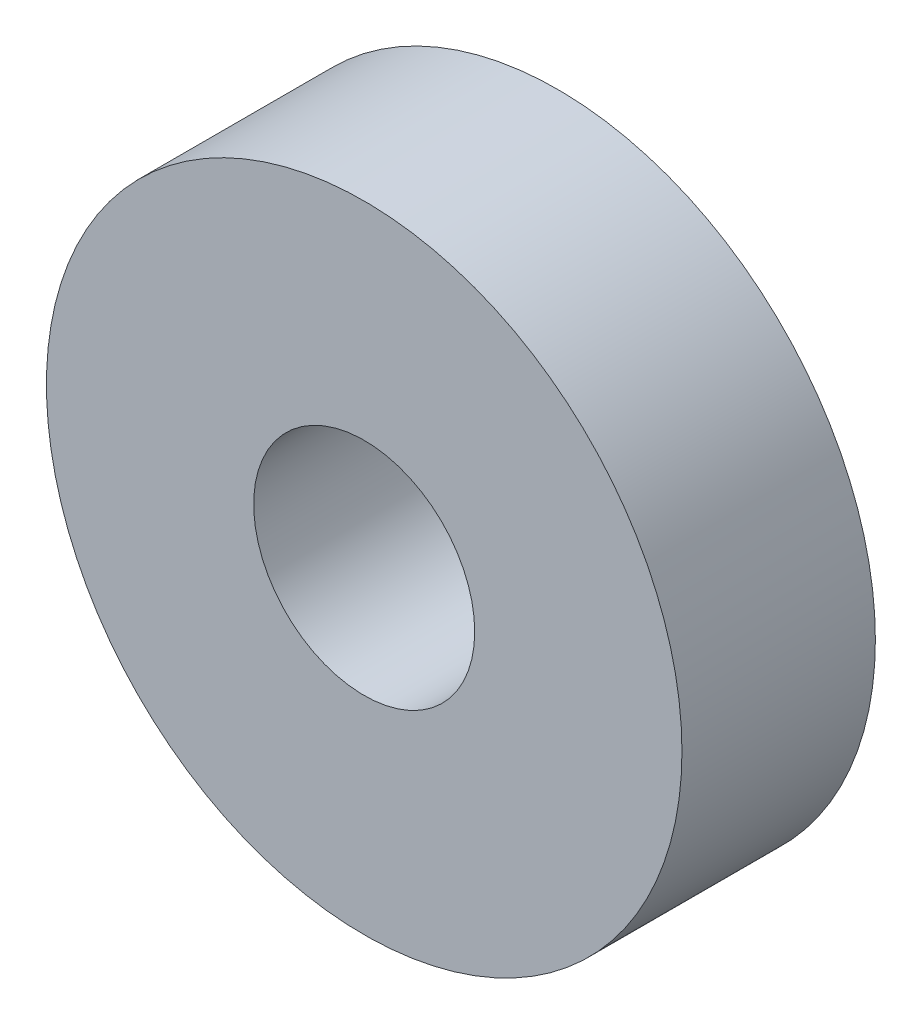
ISO-10303-21;
HEADER;
FILE_DESCRIPTION(('STEP AP214'),'2;1');
FILE_NAME('part.step','',(''),(''),'','','');
FILE_SCHEMA(('AUTOMOTIVE_DESIGN { 1 0 10303 214 1 1 1 1 }'));
ENDSEC;
DATA;
#1=APPLICATION_CONTEXT('core data for automotive mechanical design processes');
#2=APPLICATION_PROTOCOL_DEFINITION('international standard','automotive_design',2000,#1);
#3=PRODUCT_CONTEXT('',#1,'mechanical');
#4=PRODUCT('Part','Part','',(#3));
#5=PRODUCT_RELATED_PRODUCT_CATEGORY('part','',(#4));
#6=PRODUCT_DEFINITION_FORMATION('','',#4);
#7=PRODUCT_DEFINITION_CONTEXT('part definition',#1,'design');
#8=PRODUCT_DEFINITION('design','',#6,#7);
#9=PRODUCT_DEFINITION_SHAPE('','',#8);
#10=(LENGTH_UNIT() NAMED_UNIT(*) SI_UNIT(.MILLI.,.METRE.));
#11=(NAMED_UNIT(*) PLANE_ANGLE_UNIT() SI_UNIT($,.RADIAN.));
#12=(NAMED_UNIT(*) SI_UNIT($,.STERADIAN.) SOLID_ANGLE_UNIT());
#13=UNCERTAINTY_MEASURE_WITH_UNIT(LENGTH_MEASURE(1.E-05),#10,'distance_accuracy_value','');
#14=(GEOMETRIC_REPRESENTATION_CONTEXT(3) GLOBAL_UNCERTAINTY_ASSIGNED_CONTEXT((#13)) GLOBAL_UNIT_ASSIGNED_CONTEXT((#10,
#11,#12)) REPRESENTATION_CONTEXT('',''));
#15=CARTESIAN_POINT('',(0.,0.,0.));
#16=DIRECTION('',(0.,0.,1.));
#17=DIRECTION('',(1.,0.,0.));
#18=AXIS2_PLACEMENT_3D('',#15,#16,#17);
#19=CARTESIAN_POINT('',(0.,0.,7.));
#20=DIRECTION('',(0.,0.,1.));
#21=DIRECTION('',(1.,0.,0.));
#22=AXIS2_PLACEMENT_3D('',#19,#20,#21);
#23=PLANE('',#22);
#24=CARTESIAN_POINT('',(0.,0.,7.));
#25=DIRECTION('',(0.,0.,1.));
#26=DIRECTION('',(1.,0.,0.));
#27=AXIS2_PLACEMENT_3D('',#24,#25,#26);
#28=CIRCLE('',#27,11.5);
#29=CARTESIAN_POINT('',(11.5,0.,7.));
#30=VERTEX_POINT('',#29);
#31=EDGE_CURVE('E10',#30,#30,#28,.T.);
#32=ORIENTED_EDGE('',*,*,#31,.T.);
#33=EDGE_LOOP('',(#32));
#34=FACE_BOUND('',#33,.T.);
#35=CARTESIAN_POINT('',(0.,0.,7.));
#36=DIRECTION('',(0.,0.,1.));
#37=DIRECTION('',(1.,0.,0.));
#38=AXIS2_PLACEMENT_3D('',#35,#36,#37);
#39=CIRCLE('',#38,4.);
#40=CARTESIAN_POINT('',(4.,0.,7.));
#41=VERTEX_POINT('',#40);
#42=EDGE_CURVE('E45',#41,#41,#39,.T.);
#43=ORIENTED_EDGE('',*,*,#42,.F.);
#44=EDGE_LOOP('',(#43));
#45=FACE_BOUND('',#44,.T.);
#46=ADVANCED_FACE('F34',(#34,#45),#23,.T.);
#47=CARTESIAN_POINT('',(0.,0.,0.));
#48=DIRECTION('',(0.,0.,1.));
#49=DIRECTION('',(1.,0.,0.));
#50=AXIS2_PLACEMENT_3D('',#47,#48,#49);
#51=PLANE('',#50);
#52=CARTESIAN_POINT('',(0.,0.,0.));
#53=DIRECTION('',(0.,0.,1.));
#54=DIRECTION('',(1.,0.,0.));
#55=AXIS2_PLACEMENT_3D('',#52,#53,#54);
#56=CIRCLE('',#55,11.5);
#57=CARTESIAN_POINT('',(11.5,0.,0.));
#58=VERTEX_POINT('',#57);
#59=EDGE_CURVE('E38',#58,#58,#56,.T.);
#60=ORIENTED_EDGE('',*,*,#59,.F.);
#61=EDGE_LOOP('',(#60));
#62=FACE_BOUND('',#61,.T.);
#63=CARTESIAN_POINT('',(0.,0.,0.));
#64=DIRECTION('',(0.,0.,1.));
#65=DIRECTION('',(1.,0.,0.));
#66=AXIS2_PLACEMENT_3D('',#63,#64,#65);
#67=CIRCLE('',#66,4.);
#68=CARTESIAN_POINT('',(4.,0.,0.));
#69=VERTEX_POINT('',#68);
#70=EDGE_CURVE('E47',#69,#69,#67,.T.);
#71=ORIENTED_EDGE('',*,*,#70,.T.);
#72=EDGE_LOOP('',(#71));
#73=FACE_BOUND('',#72,.T.);
#74=ADVANCED_FACE('F57',(#62,#73),#51,.F.);
#75=CARTESIAN_POINT('',(0.,0.,7.));
#76=DIRECTION('',(0.,0.,-1.));
#77=DIRECTION('',(-1.,0.,0.));
#78=AXIS2_PLACEMENT_3D('',#75,#76,#77);
#79=CYLINDRICAL_SURFACE('',#78,11.5);
#80=ORIENTED_EDGE('',*,*,#31,.F.);
#81=EDGE_LOOP('',(#80));
#82=FACE_BOUND('',#81,.T.);
#83=ORIENTED_EDGE('',*,*,#59,.T.);
#84=EDGE_LOOP('',(#83));
#85=FACE_BOUND('',#84,.T.);
#86=ADVANCED_FACE('F36',(#82,#85),#79,.T.);
#87=CARTESIAN_POINT('',(0.,0.,7.));
#88=DIRECTION('',(0.,0.,-1.));
#89=DIRECTION('',(-1.,0.,0.));
#90=AXIS2_PLACEMENT_3D('',#87,#88,#89);
#91=CYLINDRICAL_SURFACE('',#90,4.);
#92=ORIENTED_EDGE('',*,*,#42,.T.);
#93=EDGE_LOOP('',(#92));
#94=FACE_BOUND('',#93,.T.);
#95=ORIENTED_EDGE('',*,*,#70,.F.);
#96=EDGE_LOOP('',(#95));
#97=FACE_BOUND('',#96,.T.);
#98=ADVANCED_FACE('F53',(#94,#97),#91,.F.);
#99=CLOSED_SHELL('',(#46,#74,#86,#98));
#100=MANIFOLD_SOLID_BREP('B2',#99);
#101=ADVANCED_BREP_SHAPE_REPRESENTATION('',(#18,#100),#14);
#102=SHAPE_DEFINITION_REPRESENTATION(#9,#101);
ENDSEC;
END-ISO-10303-21;
